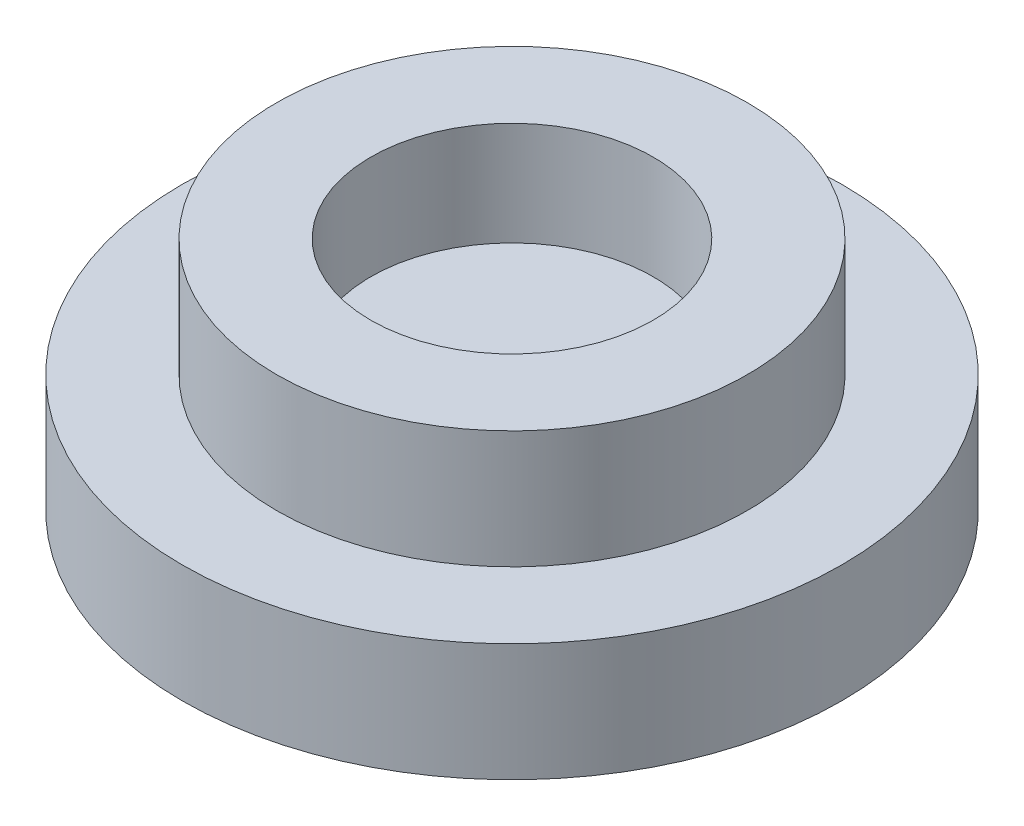
ISO-10303-21;
HEADER;
FILE_DESCRIPTION(('STEP AP214'),'2;1');
FILE_NAME('part.step','',(''),(''),'','','');
FILE_SCHEMA(('AUTOMOTIVE_DESIGN { 1 0 10303 214 1 1 1 1 }'));
ENDSEC;
DATA;
#1=APPLICATION_CONTEXT('core data for automotive mechanical design processes');
#2=APPLICATION_PROTOCOL_DEFINITION('international standard','automotive_design',2000,#1);
#3=PRODUCT_CONTEXT('',#1,'mechanical');
#4=PRODUCT('Part','Part','',(#3));
#5=PRODUCT_RELATED_PRODUCT_CATEGORY('part','',(#4));
#6=PRODUCT_DEFINITION_FORMATION('','',#4);
#7=PRODUCT_DEFINITION_CONTEXT('part definition',#1,'design');
#8=PRODUCT_DEFINITION('design','',#6,#7);
#9=PRODUCT_DEFINITION_SHAPE('','',#8);
#10=(LENGTH_UNIT() NAMED_UNIT(*) SI_UNIT(.MILLI.,.METRE.));
#11=(NAMED_UNIT(*) PLANE_ANGLE_UNIT() SI_UNIT($,.RADIAN.));
#12=(NAMED_UNIT(*) SI_UNIT($,.STERADIAN.) SOLID_ANGLE_UNIT());
#13=UNCERTAINTY_MEASURE_WITH_UNIT(LENGTH_MEASURE(1.E-05),#10,'distance_accuracy_value','');
#14=(GEOMETRIC_REPRESENTATION_CONTEXT(3) GLOBAL_UNCERTAINTY_ASSIGNED_CONTEXT((#13)) GLOBAL_UNIT_ASSIGNED_CONTEXT((#10,
#11,#12)) REPRESENTATION_CONTEXT('',''));
#15=CARTESIAN_POINT('',(0.,0.,0.));
#16=DIRECTION('',(0.,0.,1.));
#17=DIRECTION('',(1.,0.,0.));
#18=AXIS2_PLACEMENT_3D('',#15,#16,#17);
#19=CARTESIAN_POINT('',(0.,2.5,0.));
#20=DIRECTION('',(0.,-1.,0.));
#21=DIRECTION('',(0.,0.,-1.));
#22=AXIS2_PLACEMENT_3D('',#19,#20,#21);
#23=CYLINDRICAL_SURFACE('',#22,5.);
#24=CARTESIAN_POINT('',(0.,2.5,0.));
#25=DIRECTION('',(0.,1.,0.));
#26=DIRECTION('',(0.,0.,1.));
#27=AXIS2_PLACEMENT_3D('',#24,#25,#26);
#28=CIRCLE('',#27,5.);
#29=CARTESIAN_POINT('',(0.,2.5,5.));
#30=VERTEX_POINT('',#29);
#31=EDGE_CURVE('E10',#30,#30,#28,.T.);
#32=ORIENTED_EDGE('',*,*,#31,.F.);
#33=EDGE_LOOP('',(#32));
#34=FACE_BOUND('',#33,.T.);
#35=CARTESIAN_POINT('',(0.,0.,0.));
#36=DIRECTION('',(0.,1.,0.));
#37=DIRECTION('',(0.,0.,1.));
#38=AXIS2_PLACEMENT_3D('',#35,#36,#37);
#39=CIRCLE('',#38,5.);
#40=CARTESIAN_POINT('',(0.,0.,5.));
#41=VERTEX_POINT('',#40);
#42=EDGE_CURVE('E53',#41,#41,#39,.T.);
#43=ORIENTED_EDGE('',*,*,#42,.T.);
#44=EDGE_LOOP('',(#43));
#45=FACE_BOUND('',#44,.T.);
#46=ADVANCED_FACE('F39',(#34,#45),#23,.T.);
#47=CARTESIAN_POINT('',(0.,2.5,0.));
#48=DIRECTION('',(0.,1.,0.));
#49=DIRECTION('',(0.,0.,1.));
#50=AXIS2_PLACEMENT_3D('',#47,#48,#49);
#51=PLANE('',#50);
#52=CARTESIAN_POINT('',(0.,2.5,0.));
#53=DIRECTION('',(0.,1.,0.));
#54=DIRECTION('',(0.,0.,1.));
#55=AXIS2_PLACEMENT_3D('',#52,#53,#54);
#56=CIRCLE('',#55,3.);
#57=CARTESIAN_POINT('',(0.,2.5,3.));
#58=VERTEX_POINT('',#57);
#59=EDGE_CURVE('E46',#58,#58,#56,.T.);
#60=ORIENTED_EDGE('',*,*,#59,.F.);
#61=EDGE_LOOP('',(#60));
#62=FACE_BOUND('',#61,.T.);
#63=ORIENTED_EDGE('',*,*,#31,.T.);
#64=EDGE_LOOP('',(#63));
#65=FACE_BOUND('',#64,.T.);
#66=ADVANCED_FACE('F93',(#62,#65),#51,.T.);
#67=CARTESIAN_POINT('',(0.,2.5,0.));
#68=DIRECTION('',(0.,-1.,0.));
#69=DIRECTION('',(0.,0.,-1.));
#70=AXIS2_PLACEMENT_3D('',#67,#68,#69);
#71=CYLINDRICAL_SURFACE('',#70,3.);
#72=ORIENTED_EDGE('',*,*,#59,.T.);
#73=EDGE_LOOP('',(#72));
#74=FACE_BOUND('',#73,.T.);
#75=CARTESIAN_POINT('',(0.,0.3,0.));
#76=DIRECTION('',(0.,1.,0.));
#77=DIRECTION('',(0.,0.,1.));
#78=AXIS2_PLACEMENT_3D('',#75,#76,#77);
#79=CIRCLE('',#78,3.);
#80=CARTESIAN_POINT('',(0.,0.3,3.));
#81=VERTEX_POINT('',#80);
#82=EDGE_CURVE('E51',#81,#81,#79,.T.);
#83=ORIENTED_EDGE('',*,*,#82,.F.);
#84=EDGE_LOOP('',(#83));
#85=FACE_BOUND('',#84,.T.);
#86=ADVANCED_FACE('F100',(#74,#85),#71,.F.);
#87=CARTESIAN_POINT('',(0.,0.3,0.));
#88=DIRECTION('',(0.,1.,0.));
#89=DIRECTION('',(0.,0.,1.));
#90=AXIS2_PLACEMENT_3D('',#87,#88,#89);
#91=PLANE('',#90);
#92=ORIENTED_EDGE('',*,*,#82,.T.);
#93=EDGE_LOOP('',(#92));
#94=FACE_BOUND('',#93,.T.);
#95=ADVANCED_FACE('F104',(#94),#91,.T.);
#96=CARTESIAN_POINT('',(0.,-2.5,0.));
#97=DIRECTION('',(0.,1.,0.));
#98=DIRECTION('',(0.,0.,1.));
#99=AXIS2_PLACEMENT_3D('',#96,#97,#98);
#100=CYLINDRICAL_SURFACE('',#99,7.);
#101=CARTESIAN_POINT('',(0.,-2.5,0.));
#102=DIRECTION('',(0.,1.,0.));
#103=DIRECTION('',(0.,0.,1.));
#104=AXIS2_PLACEMENT_3D('',#101,#102,#103);
#105=CIRCLE('',#104,7.);
#106=CARTESIAN_POINT('',(0.,-2.5,7.));
#107=VERTEX_POINT('',#106);
#108=EDGE_CURVE('E57',#107,#107,#105,.T.);
#109=ORIENTED_EDGE('',*,*,#108,.T.);
#110=EDGE_LOOP('',(#109));
#111=FACE_BOUND('',#110,.T.);
#112=CARTESIAN_POINT('',(0.,0.,0.));
#113=DIRECTION('',(0.,1.,0.));
#114=DIRECTION('',(0.,0.,1.));
#115=AXIS2_PLACEMENT_3D('',#112,#113,#114);
#116=CIRCLE('',#115,7.);
#117=CARTESIAN_POINT('',(0.,0.,7.));
#118=VERTEX_POINT('',#117);
#119=EDGE_CURVE('E61',#118,#118,#116,.T.);
#120=ORIENTED_EDGE('',*,*,#119,.F.);
#121=EDGE_LOOP('',(#120));
#122=FACE_BOUND('',#121,.T.);
#123=ADVANCED_FACE('F111',(#111,#122),#100,.T.);
#124=CARTESIAN_POINT('',(0.,-2.5,0.));
#125=DIRECTION('',(0.,1.,0.));
#126=DIRECTION('',(0.,0.,1.));
#127=AXIS2_PLACEMENT_3D('',#124,#125,#126);
#128=PLANE('',#127);
#129=CARTESIAN_POINT('',(0.,-2.5,0.));
#130=DIRECTION('',(0.,1.,0.));
#131=DIRECTION('',(0.,0.,1.));
#132=AXIS2_PLACEMENT_3D('',#129,#130,#131);
#133=CIRCLE('',#132,5.);
#134=CARTESIAN_POINT('',(0.,-2.5,5.));
#135=VERTEX_POINT('',#134);
#136=EDGE_CURVE('E45',#135,#135,#133,.T.);
#137=ORIENTED_EDGE('',*,*,#136,.T.);
#138=EDGE_LOOP('',(#137));
#139=FACE_BOUND('',#138,.T.);
#140=ORIENTED_EDGE('',*,*,#108,.F.);
#141=EDGE_LOOP('',(#140));
#142=FACE_BOUND('',#141,.T.);
#143=ADVANCED_FACE('F74',(#139,#142),#128,.F.);
#144=CARTESIAN_POINT('',(0.,0.,0.));
#145=DIRECTION('',(0.,1.,0.));
#146=DIRECTION('',(0.,0.,1.));
#147=AXIS2_PLACEMENT_3D('',#144,#145,#146);
#148=PLANE('',#147);
#149=ORIENTED_EDGE('',*,*,#42,.F.);
#150=EDGE_LOOP('',(#149));
#151=FACE_BOUND('',#150,.T.);
#152=ORIENTED_EDGE('',*,*,#119,.T.);
#153=EDGE_LOOP('',(#152));
#154=FACE_BOUND('',#153,.T.);
#155=ADVANCED_FACE('F81',(#151,#154),#148,.T.);
#156=CARTESIAN_POINT('',(0.,-3.4,0.));
#157=DIRECTION('',(0.,1.,0.));
#158=DIRECTION('',(0.,0.,1.));
#159=AXIS2_PLACEMENT_3D('',#156,#157,#158);
#160=CYLINDRICAL_SURFACE('',#159,5.);
#161=CARTESIAN_POINT('',(0.,-0.2,0.));
#162=DIRECTION('',(0.,1.,0.));
#163=DIRECTION('',(0.,0.,1.));
#164=AXIS2_PLACEMENT_3D('',#161,#162,#163);
#165=CIRCLE('',#164,5.);
#166=CARTESIAN_POINT('',(0.,-0.2,5.));
#167=VERTEX_POINT('',#166);
#168=EDGE_CURVE('E67',#167,#167,#165,.T.);
#169=ORIENTED_EDGE('',*,*,#168,.T.);
#170=EDGE_LOOP('',(#169));
#171=FACE_BOUND('',#170,.T.);
#172=ORIENTED_EDGE('',*,*,#136,.F.);
#173=EDGE_LOOP('',(#172));
#174=FACE_BOUND('',#173,.T.);
#175=ADVANCED_FACE('F76',(#171,#174),#160,.F.);
#176=CARTESIAN_POINT('',(0.,-0.2,0.));
#177=DIRECTION('',(0.,1.,0.));
#178=DIRECTION('',(0.,0.,1.));
#179=AXIS2_PLACEMENT_3D('',#176,#177,#178);
#180=PLANE('',#179);
#181=ORIENTED_EDGE('',*,*,#168,.F.);
#182=EDGE_LOOP('',(#181));
#183=FACE_BOUND('',#182,.T.);
#184=ADVANCED_FACE('F78',(#183),#180,.F.);
#185=CLOSED_SHELL('',(#46,#66,#86,#95,#123,#143,#155,#175,#184));
#186=MANIFOLD_SOLID_BREP('B2',#185);
#187=ADVANCED_BREP_SHAPE_REPRESENTATION('',(#18,#186),#14);
#188=SHAPE_DEFINITION_REPRESENTATION(#9,#187);
ENDSEC;
END-ISO-10303-21;
